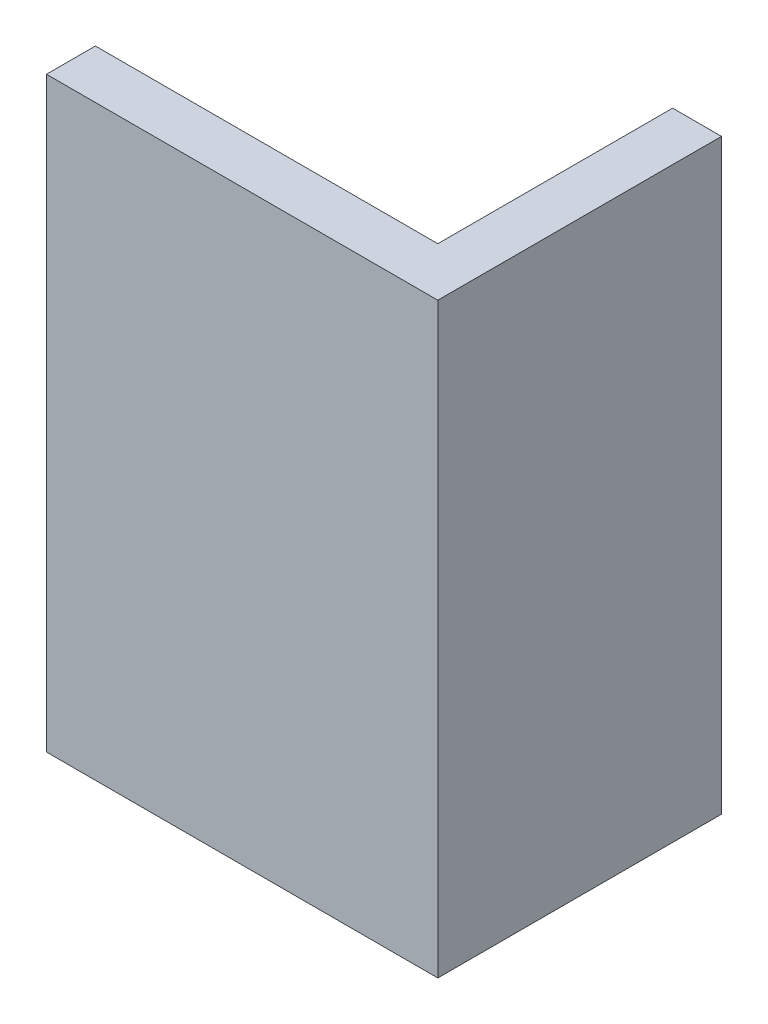
ISO-10303-21;
HEADER;
FILE_DESCRIPTION(('STEP AP214'),'2;1');
FILE_NAME('part.step','',(''),(''),'','','');
FILE_SCHEMA(('AUTOMOTIVE_DESIGN { 1 0 10303 214 1 1 1 1 }'));
ENDSEC;
DATA;
#1=APPLICATION_CONTEXT('core data for automotive mechanical design processes');
#2=APPLICATION_PROTOCOL_DEFINITION('international standard','automotive_design',2000,#1);
#3=PRODUCT_CONTEXT('',#1,'mechanical');
#4=PRODUCT('Part','Part','',(#3));
#5=PRODUCT_RELATED_PRODUCT_CATEGORY('part','',(#4));
#6=PRODUCT_DEFINITION_FORMATION('','',#4);
#7=PRODUCT_DEFINITION_CONTEXT('part definition',#1,'design');
#8=PRODUCT_DEFINITION('design','',#6,#7);
#9=PRODUCT_DEFINITION_SHAPE('','',#8);
#10=(LENGTH_UNIT() NAMED_UNIT(*) SI_UNIT(.MILLI.,.METRE.));
#11=(NAMED_UNIT(*) PLANE_ANGLE_UNIT() SI_UNIT($,.RADIAN.));
#12=(NAMED_UNIT(*) SI_UNIT($,.STERADIAN.) SOLID_ANGLE_UNIT());
#13=UNCERTAINTY_MEASURE_WITH_UNIT(LENGTH_MEASURE(1.E-05),#10,'distance_accuracy_value','');
#14=(GEOMETRIC_REPRESENTATION_CONTEXT(3) GLOBAL_UNCERTAINTY_ASSIGNED_CONTEXT((#13)) GLOBAL_UNIT_ASSIGNED_CONTEXT((#10,
#11,#12)) REPRESENTATION_CONTEXT('',''));
#15=CARTESIAN_POINT('',(0.,0.,0.));
#16=DIRECTION('',(0.,0.,1.));
#17=DIRECTION('',(1.,0.,0.));
#18=AXIS2_PLACEMENT_3D('',#15,#16,#17);
#19=CARTESIAN_POINT('',(-25.4,38.1,0.));
#20=DIRECTION('',(0.,0.,-1.));
#21=DIRECTION('',(-1.,0.,0.));
#22=AXIS2_PLACEMENT_3D('',#19,#20,#21);
#23=PLANE('',#22);
#24=DIRECTION('',(1.,0.,0.));
#25=VECTOR('',#24,1.);
#26=CARTESIAN_POINT('',(-25.4,0.,0.));
#27=LINE('',#26,#25);
#28=CARTESIAN_POINT('',(-25.4,0.,0.));
#29=VERTEX_POINT('',#28);
#30=CARTESIAN_POINT('',(0.,0.,0.));
#31=VERTEX_POINT('',#30);
#32=EDGE_CURVE('E123',#29,#31,#27,.T.);
#33=ORIENTED_EDGE('',*,*,#32,.T.);
#34=DIRECTION('',(0.,-1.,0.));
#35=VECTOR('',#34,1.);
#36=CARTESIAN_POINT('',(0.,38.1,0.));
#37=LINE('',#36,#35);
#38=CARTESIAN_POINT('',(0.,38.1,0.));
#39=VERTEX_POINT('',#38);
#40=EDGE_CURVE('E11',#39,#31,#37,.T.);
#41=ORIENTED_EDGE('',*,*,#40,.F.);
#42=DIRECTION('',(1.,0.,0.));
#43=VECTOR('',#42,1.);
#44=CARTESIAN_POINT('',(-25.4,38.1,0.));
#45=LINE('',#44,#43);
#46=CARTESIAN_POINT('',(-25.4,38.1,0.));
#47=VERTEX_POINT('',#46);
#48=EDGE_CURVE('E133',#47,#39,#45,.T.);
#49=ORIENTED_EDGE('',*,*,#48,.F.);
#50=DIRECTION('',(0.,-1.,0.));
#51=VECTOR('',#50,1.);
#52=CARTESIAN_POINT('',(-25.4,38.1,0.));
#53=LINE('',#52,#51);
#54=EDGE_CURVE('E119',#47,#29,#53,.T.);
#55=ORIENTED_EDGE('',*,*,#54,.T.);
#56=EDGE_LOOP('',(#33,#41,#49,#55));
#57=FACE_BOUND('',#56,.T.);
#58=ADVANCED_FACE('F39',(#57),#23,.F.);
#59=CARTESIAN_POINT('',(0.,38.1,0.));
#60=DIRECTION('',(-1.,0.,0.));
#61=DIRECTION('',(0.,0.,1.));
#62=AXIS2_PLACEMENT_3D('',#59,#60,#61);
#63=PLANE('',#62);
#64=DIRECTION('',(0.,0.,-1.));
#65=VECTOR('',#64,1.);
#66=CARTESIAN_POINT('',(0.,0.,0.));
#67=LINE('',#66,#65);
#68=CARTESIAN_POINT('',(0.,0.,-18.415));
#69=VERTEX_POINT('',#68);
#70=EDGE_CURVE('E126',#31,#69,#67,.T.);
#71=ORIENTED_EDGE('',*,*,#70,.T.);
#72=DIRECTION('',(0.,-1.,0.));
#73=VECTOR('',#72,1.);
#74=CARTESIAN_POINT('',(0.,38.1,-18.415));
#75=LINE('',#74,#73);
#76=CARTESIAN_POINT('',(0.,38.1,-18.415));
#77=VERTEX_POINT('',#76);
#78=EDGE_CURVE('E47',#77,#69,#75,.T.);
#79=ORIENTED_EDGE('',*,*,#78,.F.);
#80=DIRECTION('',(0.,0.,-1.));
#81=VECTOR('',#80,1.);
#82=CARTESIAN_POINT('',(0.,38.1,0.));
#83=LINE('',#82,#81);
#84=EDGE_CURVE('E92',#39,#77,#83,.T.);
#85=ORIENTED_EDGE('',*,*,#84,.F.);
#86=ORIENTED_EDGE('',*,*,#40,.T.);
#87=EDGE_LOOP('',(#71,#79,#85,#86));
#88=FACE_BOUND('',#87,.T.);
#89=ADVANCED_FACE('F157',(#88),#63,.F.);
#90=CARTESIAN_POINT('',(0.,38.1,-18.415));
#91=DIRECTION('',(0.,0.,1.));
#92=DIRECTION('',(1.,0.,0.));
#93=AXIS2_PLACEMENT_3D('',#90,#91,#92);
#94=PLANE('',#93);
#95=DIRECTION('',(-1.,0.,0.));
#96=VECTOR('',#95,1.);
#97=CARTESIAN_POINT('',(0.,0.,-18.415));
#98=LINE('',#97,#96);
#99=CARTESIAN_POINT('',(-3.175,0.,-18.415));
#100=VERTEX_POINT('',#99);
#101=EDGE_CURVE('E128',#69,#100,#98,.T.);
#102=ORIENTED_EDGE('',*,*,#101,.T.);
#103=DIRECTION('',(0.,-1.,0.));
#104=VECTOR('',#103,1.);
#105=CARTESIAN_POINT('',(-3.175,38.1,-18.415));
#106=LINE('',#105,#104);
#107=CARTESIAN_POINT('',(-3.175,38.1,-18.415));
#108=VERTEX_POINT('',#107);
#109=EDGE_CURVE('E114',#108,#100,#106,.T.);
#110=ORIENTED_EDGE('',*,*,#109,.F.);
#111=DIRECTION('',(-1.,0.,0.));
#112=VECTOR('',#111,1.);
#113=CARTESIAN_POINT('',(0.,38.1,-18.415));
#114=LINE('',#113,#112);
#115=EDGE_CURVE('E105',#77,#108,#114,.T.);
#116=ORIENTED_EDGE('',*,*,#115,.F.);
#117=ORIENTED_EDGE('',*,*,#78,.T.);
#118=EDGE_LOOP('',(#102,#110,#116,#117));
#119=FACE_BOUND('',#118,.T.);
#120=ADVANCED_FACE('F139',(#119),#94,.F.);
#121=CARTESIAN_POINT('',(-3.175,38.1,-18.415));
#122=DIRECTION('',(1.,0.,0.));
#123=DIRECTION('',(0.,0.,-1.));
#124=AXIS2_PLACEMENT_3D('',#121,#122,#123);
#125=PLANE('',#124);
#126=DIRECTION('',(0.,0.,1.));
#127=VECTOR('',#126,1.);
#128=CARTESIAN_POINT('',(-3.175,0.,-18.415));
#129=LINE('',#128,#127);
#130=CARTESIAN_POINT('',(-3.175,0.,-3.175));
#131=VERTEX_POINT('',#130);
#132=EDGE_CURVE('E113',#100,#131,#129,.T.);
#133=ORIENTED_EDGE('',*,*,#132,.T.);
#134=DIRECTION('',(0.,-1.,0.));
#135=VECTOR('',#134,1.);
#136=CARTESIAN_POINT('',(-3.175,38.1,-3.175));
#137=LINE('',#136,#135);
#138=CARTESIAN_POINT('',(-3.175,38.1,-3.175));
#139=VERTEX_POINT('',#138);
#140=EDGE_CURVE('E110',#139,#131,#137,.T.);
#141=ORIENTED_EDGE('',*,*,#140,.F.);
#142=DIRECTION('',(0.,0.,1.));
#143=VECTOR('',#142,1.);
#144=CARTESIAN_POINT('',(-3.175,38.1,-18.415));
#145=LINE('',#144,#143);
#146=EDGE_CURVE('E99',#108,#139,#145,.T.);
#147=ORIENTED_EDGE('',*,*,#146,.F.);
#148=ORIENTED_EDGE('',*,*,#109,.T.);
#149=EDGE_LOOP('',(#133,#141,#147,#148));
#150=FACE_BOUND('',#149,.T.);
#151=ADVANCED_FACE('F111',(#150),#125,.F.);
#152=CARTESIAN_POINT('',(-3.175,38.1,-3.175));
#153=DIRECTION('',(0.,0.,1.));
#154=DIRECTION('',(1.,0.,0.));
#155=AXIS2_PLACEMENT_3D('',#152,#153,#154);
#156=PLANE('',#155);
#157=DIRECTION('',(-1.,0.,0.));
#158=VECTOR('',#157,1.);
#159=CARTESIAN_POINT('',(-3.175,0.,-3.175));
#160=LINE('',#159,#158);
#161=CARTESIAN_POINT('',(-25.4,0.,-3.175));
#162=VERTEX_POINT('',#161);
#163=EDGE_CURVE('E78',#131,#162,#160,.T.);
#164=ORIENTED_EDGE('',*,*,#163,.T.);
#165=DIRECTION('',(0.,-1.,0.));
#166=VECTOR('',#165,1.);
#167=CARTESIAN_POINT('',(-25.4,38.1,-3.175));
#168=LINE('',#167,#166);
#169=CARTESIAN_POINT('',(-25.4,38.1,-3.175));
#170=VERTEX_POINT('',#169);
#171=EDGE_CURVE('E115',#170,#162,#168,.T.);
#172=ORIENTED_EDGE('',*,*,#171,.F.);
#173=DIRECTION('',(-1.,0.,0.));
#174=VECTOR('',#173,1.);
#175=CARTESIAN_POINT('',(-3.175,38.1,-3.175));
#176=LINE('',#175,#174);
#177=EDGE_CURVE('E103',#139,#170,#176,.T.);
#178=ORIENTED_EDGE('',*,*,#177,.F.);
#179=ORIENTED_EDGE('',*,*,#140,.T.);
#180=EDGE_LOOP('',(#164,#172,#178,#179));
#181=FACE_BOUND('',#180,.T.);
#182=ADVANCED_FACE('F117',(#181),#156,.F.);
#183=CARTESIAN_POINT('',(-25.4,38.1,-3.175));
#184=DIRECTION('',(1.,0.,0.));
#185=DIRECTION('',(0.,0.,-1.));
#186=AXIS2_PLACEMENT_3D('',#183,#184,#185);
#187=PLANE('',#186);
#188=DIRECTION('',(0.,0.,1.));
#189=VECTOR('',#188,1.);
#190=CARTESIAN_POINT('',(-25.4,0.,-3.175));
#191=LINE('',#190,#189);
#192=EDGE_CURVE('E84',#162,#29,#191,.T.);
#193=ORIENTED_EDGE('',*,*,#192,.T.);
#194=ORIENTED_EDGE('',*,*,#54,.F.);
#195=DIRECTION('',(0.,0.,1.));
#196=VECTOR('',#195,1.);
#197=CARTESIAN_POINT('',(-25.4,38.1,-3.175));
#198=LINE('',#197,#196);
#199=EDGE_CURVE('E55',#170,#47,#198,.T.);
#200=ORIENTED_EDGE('',*,*,#199,.F.);
#201=ORIENTED_EDGE('',*,*,#171,.T.);
#202=EDGE_LOOP('',(#193,#194,#200,#201));
#203=FACE_BOUND('',#202,.T.);
#204=ADVANCED_FACE('F146',(#203),#187,.F.);
#205=CARTESIAN_POINT('',(0.,38.1,0.));
#206=DIRECTION('',(0.,1.,0.));
#207=DIRECTION('',(0.,0.,1.));
#208=AXIS2_PLACEMENT_3D('',#205,#206,#207);
#209=PLANE('',#208);
#210=ORIENTED_EDGE('',*,*,#48,.T.);
#211=ORIENTED_EDGE('',*,*,#84,.T.);
#212=ORIENTED_EDGE('',*,*,#115,.T.);
#213=ORIENTED_EDGE('',*,*,#146,.T.);
#214=ORIENTED_EDGE('',*,*,#177,.T.);
#215=ORIENTED_EDGE('',*,*,#199,.T.);
#216=EDGE_LOOP('',(#210,#211,#212,#213,#214,#215));
#217=FACE_BOUND('',#216,.T.);
#218=ADVANCED_FACE('F101',(#217),#209,.T.);
#219=CARTESIAN_POINT('',(0.,0.,0.));
#220=DIRECTION('',(0.,1.,0.));
#221=DIRECTION('',(0.,0.,1.));
#222=AXIS2_PLACEMENT_3D('',#219,#220,#221);
#223=PLANE('',#222);
#224=ORIENTED_EDGE('',*,*,#32,.F.);
#225=ORIENTED_EDGE('',*,*,#192,.F.);
#226=ORIENTED_EDGE('',*,*,#163,.F.);
#227=ORIENTED_EDGE('',*,*,#132,.F.);
#228=ORIENTED_EDGE('',*,*,#101,.F.);
#229=ORIENTED_EDGE('',*,*,#70,.F.);
#230=EDGE_LOOP('',(#224,#225,#226,#227,#228,#229));
#231=FACE_BOUND('',#230,.T.);
#232=ADVANCED_FACE('F142',(#231),#223,.F.);
#233=CLOSED_SHELL('',(#58,#89,#120,#151,#182,#204,#218,#232));
#234=MANIFOLD_SOLID_BREP('B2',#233);
#235=ADVANCED_BREP_SHAPE_REPRESENTATION('',(#18,#234),#14);
#236=SHAPE_DEFINITION_REPRESENTATION(#9,#235);
ENDSEC;
END-ISO-10303-21;
